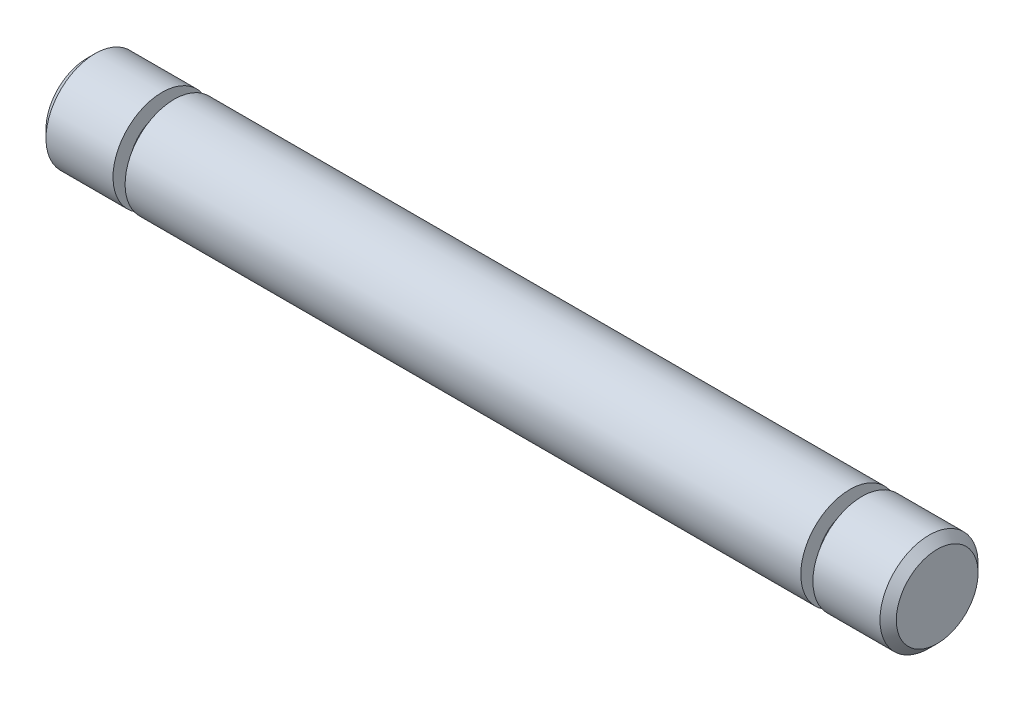
ISO-10303-21;
HEADER;
FILE_DESCRIPTION(('STEP AP214'),'2;1');
FILE_NAME('part.step','',(''),(''),'','','');
FILE_SCHEMA(('AUTOMOTIVE_DESIGN { 1 0 10303 214 1 1 1 1 }'));
ENDSEC;
DATA;
#1=APPLICATION_CONTEXT('core data for automotive mechanical design processes');
#2=APPLICATION_PROTOCOL_DEFINITION('international standard','automotive_design',2000,#1);
#3=PRODUCT_CONTEXT('',#1,'mechanical');
#4=PRODUCT('Part','Part','',(#3));
#5=PRODUCT_RELATED_PRODUCT_CATEGORY('part','',(#4));
#6=PRODUCT_DEFINITION_FORMATION('','',#4);
#7=PRODUCT_DEFINITION_CONTEXT('part definition',#1,'design');
#8=PRODUCT_DEFINITION('design','',#6,#7);
#9=PRODUCT_DEFINITION_SHAPE('','',#8);
#10=(LENGTH_UNIT() NAMED_UNIT(*) SI_UNIT(.MILLI.,.METRE.));
#11=(NAMED_UNIT(*) PLANE_ANGLE_UNIT() SI_UNIT($,.RADIAN.));
#12=(NAMED_UNIT(*) SI_UNIT($,.STERADIAN.) SOLID_ANGLE_UNIT());
#13=UNCERTAINTY_MEASURE_WITH_UNIT(LENGTH_MEASURE(1.E-05),#10,'distance_accuracy_value','');
#14=(GEOMETRIC_REPRESENTATION_CONTEXT(3) GLOBAL_UNCERTAINTY_ASSIGNED_CONTEXT((#13)) GLOBAL_UNIT_ASSIGNED_CONTEXT((#10,
#11,#12)) REPRESENTATION_CONTEXT('',''));
#15=CARTESIAN_POINT('',(0.,0.,0.));
#16=DIRECTION('',(0.,0.,1.));
#17=DIRECTION('',(1.,0.,0.));
#18=AXIS2_PLACEMENT_3D('',#15,#16,#17);
#19=CARTESIAN_POINT('',(0.,0.,0.));
#20=DIRECTION('',(-1.,0.,0.));
#21=DIRECTION('',(0.,0.,1.));
#22=AXIS2_PLACEMENT_3D('',#19,#20,#21);
#23=CYLINDRICAL_SURFACE('',#22,3.);
#24=CARTESIAN_POINT('',(20.66,0.,0.));
#25=DIRECTION('',(1.,0.,0.));
#26=DIRECTION('',(0.,1.,0.));
#27=AXIS2_PLACEMENT_3D('',#24,#25,#26);
#28=CIRCLE('',#27,3.);
#29=CARTESIAN_POINT('',(20.66,3.,0.));
#30=VERTEX_POINT('',#29);
#31=EDGE_CURVE('E63',#30,#30,#28,.T.);
#32=ORIENTED_EDGE('',*,*,#31,.F.);
#33=EDGE_LOOP('',(#32));
#34=FACE_BOUND('',#33,.T.);
#35=CARTESIAN_POINT('',(-20.66,0.,0.));
#36=DIRECTION('',(1.,0.,0.));
#37=DIRECTION('',(0.,1.,0.));
#38=AXIS2_PLACEMENT_3D('',#35,#36,#37);
#39=CIRCLE('',#38,3.);
#40=CARTESIAN_POINT('',(-20.66,3.,0.));
#41=VERTEX_POINT('',#40);
#42=EDGE_CURVE('E57',#41,#41,#39,.T.);
#43=ORIENTED_EDGE('',*,*,#42,.T.);
#44=EDGE_LOOP('',(#43));
#45=FACE_BOUND('',#44,.T.);
#46=ADVANCED_FACE('F31',(#34,#45),#23,.T.);
#47=CARTESIAN_POINT('',(-21.4,0.,0.));
#48=DIRECTION('',(1.,0.,0.));
#49=DIRECTION('',(0.,1.,0.));
#50=AXIS2_PLACEMENT_3D('',#47,#48,#49);
#51=CIRCLE('',#50,3.);
#52=CARTESIAN_POINT('',(-21.4,3.,0.));
#53=VERTEX_POINT('',#52);
#54=EDGE_CURVE('E60',#53,#53,#51,.T.);
#55=ORIENTED_EDGE('',*,*,#54,.F.);
#56=EDGE_LOOP('',(#55));
#57=FACE_BOUND('',#56,.T.);
#58=CARTESIAN_POINT('',(-25.5,0.,0.));
#59=DIRECTION('',(1.,0.,0.));
#60=DIRECTION('',(0.,0.,-1.));
#61=AXIS2_PLACEMENT_3D('',#58,#59,#60);
#62=CIRCLE('',#61,3.);
#63=CARTESIAN_POINT('',(-25.5,0.,-3.));
#64=VERTEX_POINT('',#63);
#65=EDGE_CURVE('E38',#64,#64,#62,.T.);
#66=ORIENTED_EDGE('',*,*,#65,.T.);
#67=EDGE_LOOP('',(#66));
#68=FACE_BOUND('',#67,.T.);
#69=ADVANCED_FACE('F101',(#57,#68),#23,.T.);
#70=CARTESIAN_POINT('',(-26.,0.,0.));
#71=DIRECTION('',(1.,0.,0.));
#72=DIRECTION('',(0.,0.,-1.));
#73=AXIS2_PLACEMENT_3D('',#70,#71,#72);
#74=PLANE('',#73);
#75=CARTESIAN_POINT('',(-26.,0.,0.));
#76=DIRECTION('',(1.,0.,0.));
#77=DIRECTION('',(0.,0.,-1.));
#78=AXIS2_PLACEMENT_3D('',#75,#76,#77);
#79=CIRCLE('',#78,2.49999999999999);
#80=CARTESIAN_POINT('',(-26.,0.,-2.49999999999999));
#81=VERTEX_POINT('',#80);
#82=EDGE_CURVE('E46',#81,#81,#79,.F.);
#83=ORIENTED_EDGE('',*,*,#82,.T.);
#84=EDGE_LOOP('',(#83));
#85=FACE_BOUND('',#84,.T.);
#86=ADVANCED_FACE('F124',(#85),#74,.F.);
#87=CARTESIAN_POINT('',(-26.,0.,0.));
#88=DIRECTION('',(1.,0.,0.));
#89=DIRECTION('',(0.,0.,-1.));
#90=AXIS2_PLACEMENT_3D('',#87,#88,#89);
#91=CONICAL_SURFACE('',#90,2.49999999999999,0.785398163397446);
#92=ORIENTED_EDGE('',*,*,#65,.F.);
#93=EDGE_LOOP('',(#92));
#94=FACE_BOUND('',#93,.T.);
#95=ORIENTED_EDGE('',*,*,#82,.F.);
#96=EDGE_LOOP('',(#95));
#97=FACE_BOUND('',#96,.T.);
#98=ADVANCED_FACE('F119',(#94,#97),#91,.T.);
#99=CARTESIAN_POINT('',(-21.4,3.,0.));
#100=DIRECTION('',(-1.,0.,0.));
#101=DIRECTION('',(0.,-1.,0.));
#102=AXIS2_PLACEMENT_3D('',#99,#100,#101);
#103=PLANE('',#102);
#104=CARTESIAN_POINT('',(-21.4,0.,0.));
#105=DIRECTION('',(1.,0.,0.));
#106=DIRECTION('',(0.,1.,0.));
#107=AXIS2_PLACEMENT_3D('',#104,#105,#106);
#108=CIRCLE('',#107,2.);
#109=CARTESIAN_POINT('',(-21.4,2.,0.));
#110=VERTEX_POINT('',#109);
#111=EDGE_CURVE('E51',#110,#110,#108,.T.);
#112=ORIENTED_EDGE('',*,*,#111,.F.);
#113=EDGE_LOOP('',(#112));
#114=FACE_BOUND('',#113,.T.);
#115=ORIENTED_EDGE('',*,*,#54,.T.);
#116=EDGE_LOOP('',(#115));
#117=FACE_BOUND('',#116,.T.);
#118=ADVANCED_FACE('F113',(#114,#117),#103,.F.);
#119=CARTESIAN_POINT('',(0.,0.,0.));
#120=DIRECTION('',(1.,0.,0.));
#121=DIRECTION('',(0.,1.,0.));
#122=AXIS2_PLACEMENT_3D('',#119,#120,#121);
#123=CYLINDRICAL_SURFACE('',#122,2.);
#124=CARTESIAN_POINT('',(-20.66,0.,0.));
#125=DIRECTION('',(1.,0.,0.));
#126=DIRECTION('',(0.,1.,0.));
#127=AXIS2_PLACEMENT_3D('',#124,#125,#126);
#128=CIRCLE('',#127,2.);
#129=CARTESIAN_POINT('',(-20.66,2.,0.));
#130=VERTEX_POINT('',#129);
#131=EDGE_CURVE('E54',#130,#130,#128,.T.);
#132=ORIENTED_EDGE('',*,*,#131,.F.);
#133=EDGE_LOOP('',(#132));
#134=FACE_BOUND('',#133,.T.);
#135=ORIENTED_EDGE('',*,*,#111,.T.);
#136=EDGE_LOOP('',(#135));
#137=FACE_BOUND('',#136,.T.);
#138=ADVANCED_FACE('F107',(#134,#137),#123,.T.);
#139=CARTESIAN_POINT('',(-20.66,3.,0.));
#140=DIRECTION('',(1.,0.,0.));
#141=DIRECTION('',(0.,1.,0.));
#142=AXIS2_PLACEMENT_3D('',#139,#140,#141);
#143=PLANE('',#142);
#144=ORIENTED_EDGE('',*,*,#42,.F.);
#145=EDGE_LOOP('',(#144));
#146=FACE_BOUND('',#145,.T.);
#147=ORIENTED_EDGE('',*,*,#131,.T.);
#148=EDGE_LOOP('',(#147));
#149=FACE_BOUND('',#148,.T.);
#150=ADVANCED_FACE('F95',(#146,#149),#143,.F.);
#151=CARTESIAN_POINT('',(20.66,3.,0.));
#152=DIRECTION('',(-1.,0.,0.));
#153=DIRECTION('',(0.,-1.,0.));
#154=AXIS2_PLACEMENT_3D('',#151,#152,#153);
#155=PLANE('',#154);
#156=CARTESIAN_POINT('',(20.66,0.,0.));
#157=DIRECTION('',(1.,0.,0.));
#158=DIRECTION('',(0.,1.,0.));
#159=AXIS2_PLACEMENT_3D('',#156,#157,#158);
#160=CIRCLE('',#159,1.99999999999999);
#161=CARTESIAN_POINT('',(20.66,2.,0.));
#162=VERTEX_POINT('',#161);
#163=EDGE_CURVE('E66',#162,#162,#160,.T.);
#164=ORIENTED_EDGE('',*,*,#163,.F.);
#165=EDGE_LOOP('',(#164));
#166=FACE_BOUND('',#165,.T.);
#167=ORIENTED_EDGE('',*,*,#31,.T.);
#168=EDGE_LOOP('',(#167));
#169=FACE_BOUND('',#168,.T.);
#170=ADVANCED_FACE('F89',(#166,#169),#155,.F.);
#171=CARTESIAN_POINT('',(0.,0.,0.));
#172=DIRECTION('',(1.,0.,0.));
#173=DIRECTION('',(0.,1.,0.));
#174=AXIS2_PLACEMENT_3D('',#171,#172,#173);
#175=CYLINDRICAL_SURFACE('',#174,1.99999999999999);
#176=CARTESIAN_POINT('',(21.4,0.,0.));
#177=DIRECTION('',(1.,0.,0.));
#178=DIRECTION('',(0.,1.,0.));
#179=AXIS2_PLACEMENT_3D('',#176,#177,#178);
#180=CIRCLE('',#179,1.99999999999999);
#181=CARTESIAN_POINT('',(21.4,2.,0.));
#182=VERTEX_POINT('',#181);
#183=EDGE_CURVE('E69',#182,#182,#180,.T.);
#184=ORIENTED_EDGE('',*,*,#183,.F.);
#185=EDGE_LOOP('',(#184));
#186=FACE_BOUND('',#185,.T.);
#187=ORIENTED_EDGE('',*,*,#163,.T.);
#188=EDGE_LOOP('',(#187));
#189=FACE_BOUND('',#188,.T.);
#190=ADVANCED_FACE('F83',(#186,#189),#175,.T.);
#191=CARTESIAN_POINT('',(21.4,3.,0.));
#192=DIRECTION('',(1.,0.,0.));
#193=DIRECTION('',(0.,1.,0.));
#194=AXIS2_PLACEMENT_3D('',#191,#192,#193);
#195=PLANE('',#194);
#196=CARTESIAN_POINT('',(21.4,0.,0.));
#197=DIRECTION('',(1.,0.,0.));
#198=DIRECTION('',(0.,1.,0.));
#199=AXIS2_PLACEMENT_3D('',#196,#197,#198);
#200=CIRCLE('',#199,3.);
#201=CARTESIAN_POINT('',(21.4,3.,0.));
#202=VERTEX_POINT('',#201);
#203=EDGE_CURVE('E72',#202,#202,#200,.T.);
#204=ORIENTED_EDGE('',*,*,#203,.F.);
#205=EDGE_LOOP('',(#204));
#206=FACE_BOUND('',#205,.T.);
#207=ORIENTED_EDGE('',*,*,#183,.T.);
#208=EDGE_LOOP('',(#207));
#209=FACE_BOUND('',#208,.T.);
#210=ADVANCED_FACE('F79',(#206,#209),#195,.F.);
#211=CARTESIAN_POINT('',(26.,0.,0.));
#212=DIRECTION('',(-1.,0.,0.));
#213=DIRECTION('',(0.,0.,1.));
#214=AXIS2_PLACEMENT_3D('',#211,#212,#213);
#215=PLANE('',#214);
#216=CARTESIAN_POINT('',(26.,0.,0.));
#217=DIRECTION('',(-1.,0.,0.));
#218=DIRECTION('',(0.,0.,1.));
#219=AXIS2_PLACEMENT_3D('',#216,#217,#218);
#220=CIRCLE('',#219,2.50000000000002);
#221=CARTESIAN_POINT('',(26.,0.,2.50000000000002));
#222=VERTEX_POINT('',#221);
#223=EDGE_CURVE('E10',#222,#222,#220,.F.);
#224=ORIENTED_EDGE('',*,*,#223,.T.);
#225=EDGE_LOOP('',(#224));
#226=FACE_BOUND('',#225,.T.);
#227=ADVANCED_FACE('F82',(#226),#215,.F.);
#228=CARTESIAN_POINT('',(25.5,0.,0.));
#229=DIRECTION('',(-1.,0.,0.));
#230=DIRECTION('',(0.,0.,1.));
#231=AXIS2_PLACEMENT_3D('',#228,#229,#230);
#232=CONICAL_SURFACE('',#231,3.,0.785398163397453);
#233=ORIENTED_EDGE('',*,*,#223,.F.);
#234=EDGE_LOOP('',(#233));
#235=FACE_BOUND('',#234,.T.);
#236=CARTESIAN_POINT('',(25.5,0.,0.));
#237=DIRECTION('',(-1.,0.,0.));
#238=DIRECTION('',(0.,0.,1.));
#239=AXIS2_PLACEMENT_3D('',#236,#237,#238);
#240=CIRCLE('',#239,3.);
#241=CARTESIAN_POINT('',(25.5,0.,3.));
#242=VERTEX_POINT('',#241);
#243=EDGE_CURVE('E42',#242,#242,#240,.T.);
#244=ORIENTED_EDGE('',*,*,#243,.F.);
#245=EDGE_LOOP('',(#244));
#246=FACE_BOUND('',#245,.T.);
#247=ADVANCED_FACE('F33',(#235,#246),#232,.T.);
#248=ORIENTED_EDGE('',*,*,#203,.T.);
#249=EDGE_LOOP('',(#248));
#250=FACE_BOUND('',#249,.T.);
#251=ORIENTED_EDGE('',*,*,#243,.T.);
#252=EDGE_LOOP('',(#251));
#253=FACE_BOUND('',#252,.T.);
#254=ADVANCED_FACE('F76',(#250,#253),#23,.T.);
#255=CLOSED_SHELL('',(#46,#69,#86,#98,#118,#138,#150,#170,#190,#210,#227,#247,#254));
#256=MANIFOLD_SOLID_BREP('B2',#255);
#257=ADVANCED_BREP_SHAPE_REPRESENTATION('',(#18,#256),#14);
#258=SHAPE_DEFINITION_REPRESENTATION(#9,#257);
ENDSEC;
END-ISO-10303-21;
